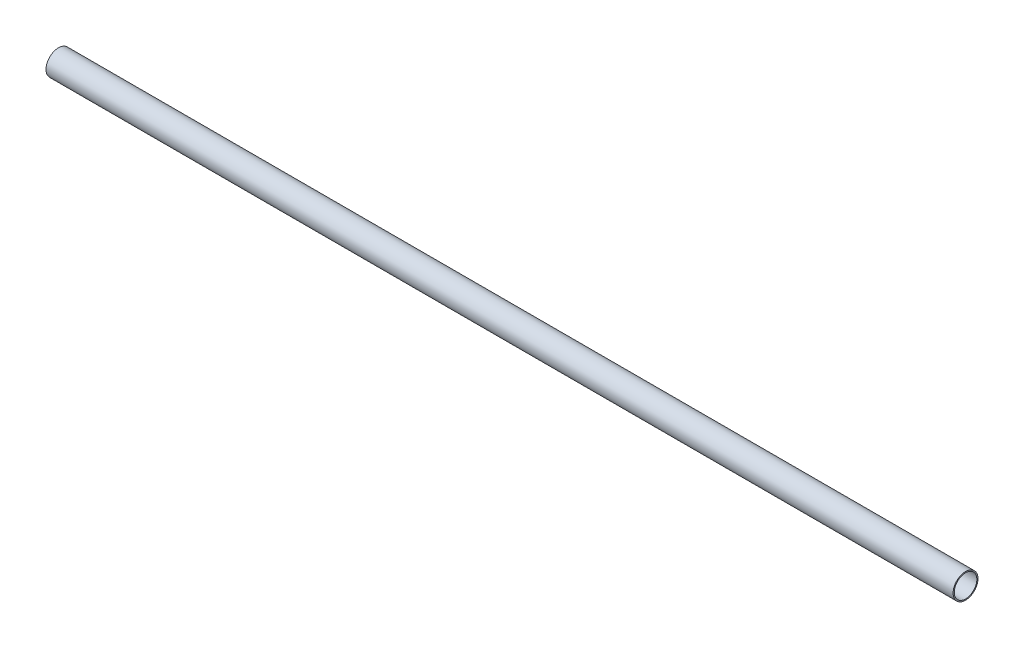
ISO-10303-21;
HEADER;
FILE_DESCRIPTION(('STEP AP214'),'2;1');
FILE_NAME('part.step','',(''),(''),'','','');
FILE_SCHEMA(('AUTOMOTIVE_DESIGN { 1 0 10303 214 1 1 1 1 }'));
ENDSEC;
DATA;
#1=APPLICATION_CONTEXT('core data for automotive mechanical design processes');
#2=APPLICATION_PROTOCOL_DEFINITION('international standard','automotive_design',2000,#1);
#3=PRODUCT_CONTEXT('',#1,'mechanical');
#4=PRODUCT('Part','Part','',(#3));
#5=PRODUCT_RELATED_PRODUCT_CATEGORY('part','',(#4));
#6=PRODUCT_DEFINITION_FORMATION('','',#4);
#7=PRODUCT_DEFINITION_CONTEXT('part definition',#1,'design');
#8=PRODUCT_DEFINITION('design','',#6,#7);
#9=PRODUCT_DEFINITION_SHAPE('','',#8);
#10=(LENGTH_UNIT() NAMED_UNIT(*) SI_UNIT(.MILLI.,.METRE.));
#11=(NAMED_UNIT(*) PLANE_ANGLE_UNIT() SI_UNIT($,.RADIAN.));
#12=(NAMED_UNIT(*) SI_UNIT($,.STERADIAN.) SOLID_ANGLE_UNIT());
#13=UNCERTAINTY_MEASURE_WITH_UNIT(LENGTH_MEASURE(1.E-05),#10,'distance_accuracy_value','');
#14=(GEOMETRIC_REPRESENTATION_CONTEXT(3) GLOBAL_UNCERTAINTY_ASSIGNED_CONTEXT((#13)) GLOBAL_UNIT_ASSIGNED_CONTEXT((#10,
#11,#12)) REPRESENTATION_CONTEXT('',''));
#15=CARTESIAN_POINT('',(0.,0.,0.));
#16=DIRECTION('',(0.,0.,1.));
#17=DIRECTION('',(1.,0.,0.));
#18=AXIS2_PLACEMENT_3D('',#15,#16,#17);
#19=CARTESIAN_POINT('',(0.,0.,0.));
#20=DIRECTION('',(1.,0.,0.));
#21=DIRECTION('',(0.,0.,-1.));
#22=AXIS2_PLACEMENT_3D('',#19,#20,#21);
#23=PLANE('',#22);
#24=CARTESIAN_POINT('',(0.,0.,0.));
#25=DIRECTION('',(1.,0.,0.));
#26=DIRECTION('',(0.,0.,-1.));
#27=AXIS2_PLACEMENT_3D('',#24,#25,#26);
#28=CIRCLE('',#27,9.525);
#29=CARTESIAN_POINT('',(0.,0.,-9.525));
#30=VERTEX_POINT('',#29);
#31=EDGE_CURVE('E39',#30,#30,#28,.T.);
#32=ORIENTED_EDGE('',*,*,#31,.F.);
#33=EDGE_LOOP('',(#32));
#34=FACE_BOUND('',#33,.T.);
#35=CARTESIAN_POINT('',(0.,0.,0.));
#36=DIRECTION('',(1.,0.,0.));
#37=DIRECTION('',(0.,0.,-1.));
#38=AXIS2_PLACEMENT_3D('',#35,#36,#37);
#39=CIRCLE('',#38,8.636);
#40=CARTESIAN_POINT('',(0.,0.,-8.636));
#41=VERTEX_POINT('',#40);
#42=EDGE_CURVE('E49',#41,#41,#39,.T.);
#43=ORIENTED_EDGE('',*,*,#42,.T.);
#44=EDGE_LOOP('',(#43));
#45=FACE_BOUND('',#44,.T.);
#46=ADVANCED_FACE('F35',(#34,#45),#23,.F.);
#47=CARTESIAN_POINT('',(720.525371364013,0.,0.));
#48=DIRECTION('',(-1.,0.,0.));
#49=DIRECTION('',(0.,0.,1.));
#50=AXIS2_PLACEMENT_3D('',#47,#48,#49);
#51=CYLINDRICAL_SURFACE('',#50,9.525);
#52=CARTESIAN_POINT('',(693.584603000805,-1.09702439682187E-13,-1.10971857579013E-13));
#53=DIRECTION('',(-1.,0.,0.));
#54=DIRECTION('',(0.,-0.0310763428015221,0.999517013821217));
#55=AXIS2_PLACEMENT_3D('',#52,#53,#54);
#56=CIRCLE('',#55,9.525);
#57=CARTESIAN_POINT('',(693.584603000805,-0.296002165184608,9.52039955664698));
#58=VERTEX_POINT('',#57);
#59=EDGE_CURVE('E10',#58,#58,#56,.T.);
#60=ORIENTED_EDGE('',*,*,#59,.T.);
#61=EDGE_LOOP('',(#60));
#62=FACE_BOUND('',#61,.T.);
#63=ORIENTED_EDGE('',*,*,#31,.T.);
#64=EDGE_LOOP('',(#63));
#65=FACE_BOUND('',#64,.T.);
#66=ADVANCED_FACE('F37',(#62,#65),#51,.T.);
#67=CARTESIAN_POINT('',(720.525371364013,0.,0.));
#68=DIRECTION('',(-1.,0.,0.));
#69=DIRECTION('',(0.,0.,1.));
#70=AXIS2_PLACEMENT_3D('',#67,#68,#69);
#71=CYLINDRICAL_SURFACE('',#70,8.636);
#72=CARTESIAN_POINT('',(693.584603000805,-1.09702439682187E-13,-1.10971857579013E-13));
#73=DIRECTION('',(-1.,0.,0.));
#74=DIRECTION('',(0.,-0.0310763428015221,0.999517013821217));
#75=AXIS2_PLACEMENT_3D('',#72,#73,#74);
#76=CIRCLE('',#75,8.636);
#77=CARTESIAN_POINT('',(693.584603000805,-0.268375296434055,8.63182893135992));
#78=VERTEX_POINT('',#77);
#79=EDGE_CURVE('E43',#78,#78,#76,.T.);
#80=ORIENTED_EDGE('',*,*,#79,.F.);
#81=EDGE_LOOP('',(#80));
#82=FACE_BOUND('',#81,.T.);
#83=ORIENTED_EDGE('',*,*,#42,.F.);
#84=EDGE_LOOP('',(#83));
#85=FACE_BOUND('',#84,.T.);
#86=ADVANCED_FACE('F61',(#82,#85),#71,.F.);
#87=CARTESIAN_POINT('',(693.584603000805,-1.09702439682187E-13,-1.10971857579013E-13));
#88=DIRECTION('',(-1.,0.,0.));
#89=DIRECTION('',(0.,-0.0310763428015221,0.999517013821217));
#90=AXIS2_PLACEMENT_3D('',#87,#88,#89);
#91=PLANE('',#90);
#92=ORIENTED_EDGE('',*,*,#79,.T.);
#93=EDGE_LOOP('',(#92));
#94=FACE_BOUND('',#93,.T.);
#95=ORIENTED_EDGE('',*,*,#59,.F.);
#96=EDGE_LOOP('',(#95));
#97=FACE_BOUND('',#96,.T.);
#98=ADVANCED_FACE('F65',(#94,#97),#91,.F.);
#99=CLOSED_SHELL('',(#46,#66,#86,#98));
#100=MANIFOLD_SOLID_BREP('B2',#99);
#101=ADVANCED_BREP_SHAPE_REPRESENTATION('',(#18,#100),#14);
#102=SHAPE_DEFINITION_REPRESENTATION(#9,#101);
ENDSEC;
END-ISO-10303-21;
